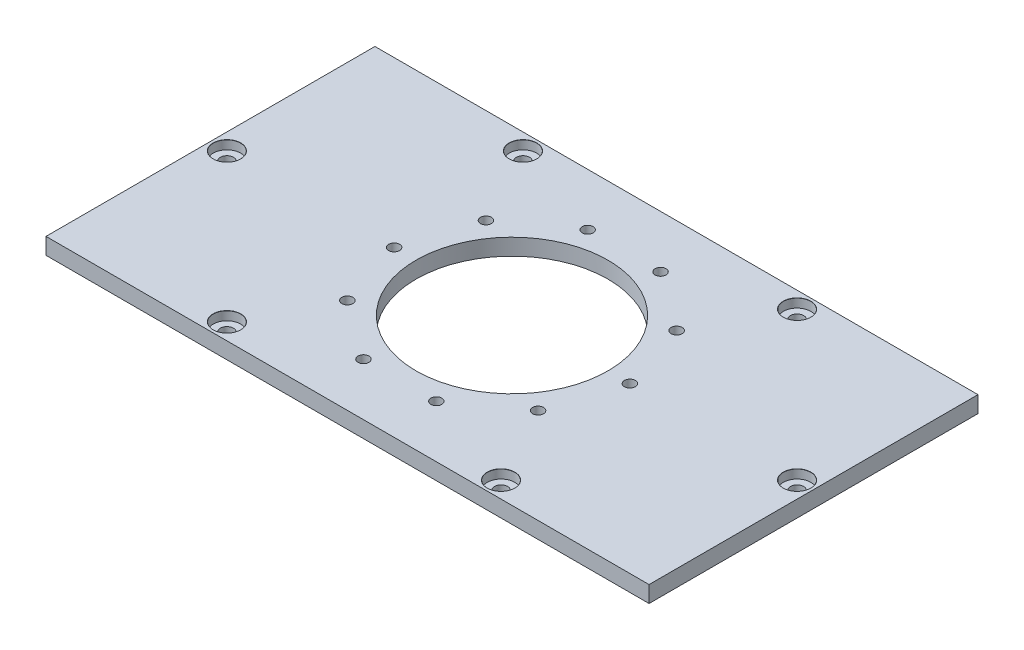
ISO-10303-21;
HEADER;
FILE_DESCRIPTION(('STEP AP214'),'2;1');
FILE_NAME('part.step','',(''),(''),'','','');
FILE_SCHEMA(('AUTOMOTIVE_DESIGN { 1 0 10303 214 1 1 1 1 }'));
ENDSEC;
DATA;
#1=APPLICATION_CONTEXT('core data for automotive mechanical design processes');
#2=APPLICATION_PROTOCOL_DEFINITION('international standard','automotive_design',2000,#1);
#3=PRODUCT_CONTEXT('',#1,'mechanical');
#4=PRODUCT('Part','Part','',(#3));
#5=PRODUCT_RELATED_PRODUCT_CATEGORY('part','',(#4));
#6=PRODUCT_DEFINITION_FORMATION('','',#4);
#7=PRODUCT_DEFINITION_CONTEXT('part definition',#1,'design');
#8=PRODUCT_DEFINITION('design','',#6,#7);
#9=PRODUCT_DEFINITION_SHAPE('','',#8);
#10=(LENGTH_UNIT() NAMED_UNIT(*) SI_UNIT(.MILLI.,.METRE.));
#11=(NAMED_UNIT(*) PLANE_ANGLE_UNIT() SI_UNIT($,.RADIAN.));
#12=(NAMED_UNIT(*) SI_UNIT($,.STERADIAN.) SOLID_ANGLE_UNIT());
#13=UNCERTAINTY_MEASURE_WITH_UNIT(LENGTH_MEASURE(1.E-05),#10,'distance_accuracy_value','');
#14=(GEOMETRIC_REPRESENTATION_CONTEXT(3) GLOBAL_UNCERTAINTY_ASSIGNED_CONTEXT((#13)) GLOBAL_UNIT_ASSIGNED_CONTEXT((#10,
#11,#12)) REPRESENTATION_CONTEXT('',''));
#15=CARTESIAN_POINT('',(0.,0.,0.));
#16=DIRECTION('',(0.,0.,1.));
#17=DIRECTION('',(1.,0.,0.));
#18=AXIS2_PLACEMENT_3D('',#15,#16,#17);
#19=CARTESIAN_POINT('',(0.,3.,0.));
#20=DIRECTION('',(1.,0.,0.));
#21=DIRECTION('',(0.,0.,-1.));
#22=AXIS2_PLACEMENT_3D('',#19,#20,#21);
#23=PLANE('',#22);
#24=DIRECTION('',(0.,0.,1.));
#25=VECTOR('',#24,1.);
#26=CARTESIAN_POINT('',(0.,0.,0.));
#27=LINE('',#26,#25);
#28=CARTESIAN_POINT('',(0.,0.,-60.));
#29=VERTEX_POINT('',#28);
#30=CARTESIAN_POINT('',(0.,0.,0.));
#31=VERTEX_POINT('',#30);
#32=EDGE_CURVE('E110',#29,#31,#27,.T.);
#33=ORIENTED_EDGE('',*,*,#32,.T.);
#34=DIRECTION('',(0.,-1.,0.));
#35=VECTOR('',#34,1.);
#36=CARTESIAN_POINT('',(0.,3.,0.));
#37=LINE('',#36,#35);
#38=CARTESIAN_POINT('',(0.,3.,0.));
#39=VERTEX_POINT('',#38);
#40=EDGE_CURVE('E11',#39,#31,#37,.T.);
#41=ORIENTED_EDGE('',*,*,#40,.F.);
#42=DIRECTION('',(0.,0.,1.));
#43=VECTOR('',#42,1.);
#44=CARTESIAN_POINT('',(0.,3.,0.));
#45=LINE('',#44,#43);
#46=CARTESIAN_POINT('',(0.,3.,-60.));
#47=VERTEX_POINT('',#46);
#48=EDGE_CURVE('E93',#47,#39,#45,.T.);
#49=ORIENTED_EDGE('',*,*,#48,.F.);
#50=DIRECTION('',(0.,-1.,0.));
#51=VECTOR('',#50,1.);
#52=CARTESIAN_POINT('',(0.,3.,-60.));
#53=LINE('',#52,#51);
#54=EDGE_CURVE('E106',#47,#29,#53,.T.);
#55=ORIENTED_EDGE('',*,*,#54,.T.);
#56=EDGE_LOOP('',(#33,#41,#49,#55));
#57=FACE_BOUND('',#56,.T.);
#58=ADVANCED_FACE('F39',(#57),#23,.F.);
#59=CARTESIAN_POINT('',(0.,3.,0.));
#60=DIRECTION('',(0.,0.,-1.));
#61=DIRECTION('',(-1.,0.,0.));
#62=AXIS2_PLACEMENT_3D('',#59,#60,#61);
#63=PLANE('',#62);
#64=DIRECTION('',(1.,0.,0.));
#65=VECTOR('',#64,1.);
#66=CARTESIAN_POINT('',(0.,0.,0.));
#67=LINE('',#66,#65);
#68=CARTESIAN_POINT('',(110.,0.,0.));
#69=VERTEX_POINT('',#68);
#70=EDGE_CURVE('E98',#31,#69,#67,.T.);
#71=ORIENTED_EDGE('',*,*,#70,.T.);
#72=DIRECTION('',(0.,-1.,0.));
#73=VECTOR('',#72,1.);
#74=CARTESIAN_POINT('',(110.,3.,0.));
#75=LINE('',#74,#73);
#76=CARTESIAN_POINT('',(110.,3.,0.));
#77=VERTEX_POINT('',#76);
#78=EDGE_CURVE('E49',#77,#69,#75,.T.);
#79=ORIENTED_EDGE('',*,*,#78,.F.);
#80=DIRECTION('',(1.,0.,0.));
#81=VECTOR('',#80,1.);
#82=CARTESIAN_POINT('',(0.,3.,0.));
#83=LINE('',#82,#81);
#84=EDGE_CURVE('E88',#39,#77,#83,.T.);
#85=ORIENTED_EDGE('',*,*,#84,.F.);
#86=ORIENTED_EDGE('',*,*,#40,.T.);
#87=EDGE_LOOP('',(#71,#79,#85,#86));
#88=FACE_BOUND('',#87,.T.);
#89=ADVANCED_FACE('F97',(#88),#63,.F.);
#90=CARTESIAN_POINT('',(110.,3.,0.));
#91=DIRECTION('',(-1.,0.,0.));
#92=DIRECTION('',(0.,0.,1.));
#93=AXIS2_PLACEMENT_3D('',#90,#91,#92);
#94=PLANE('',#93);
#95=DIRECTION('',(0.,0.,-1.));
#96=VECTOR('',#95,1.);
#97=CARTESIAN_POINT('',(110.,0.,0.));
#98=LINE('',#97,#96);
#99=CARTESIAN_POINT('',(110.,0.,-60.));
#100=VERTEX_POINT('',#99);
#101=EDGE_CURVE('E75',#69,#100,#98,.T.);
#102=ORIENTED_EDGE('',*,*,#101,.T.);
#103=DIRECTION('',(0.,-1.,0.));
#104=VECTOR('',#103,1.);
#105=CARTESIAN_POINT('',(110.,3.,-60.));
#106=LINE('',#105,#104);
#107=CARTESIAN_POINT('',(110.,3.,-60.));
#108=VERTEX_POINT('',#107);
#109=EDGE_CURVE('E100',#108,#100,#106,.T.);
#110=ORIENTED_EDGE('',*,*,#109,.F.);
#111=DIRECTION('',(0.,0.,-1.));
#112=VECTOR('',#111,1.);
#113=CARTESIAN_POINT('',(110.,3.,0.));
#114=LINE('',#113,#112);
#115=EDGE_CURVE('E91',#77,#108,#114,.T.);
#116=ORIENTED_EDGE('',*,*,#115,.F.);
#117=ORIENTED_EDGE('',*,*,#78,.T.);
#118=EDGE_LOOP('',(#102,#110,#116,#117));
#119=FACE_BOUND('',#118,.T.);
#120=ADVANCED_FACE('F102',(#119),#94,.F.);
#121=CARTESIAN_POINT('',(0.,3.,-60.));
#122=DIRECTION('',(0.,0.,1.));
#123=DIRECTION('',(1.,0.,0.));
#124=AXIS2_PLACEMENT_3D('',#121,#122,#123);
#125=PLANE('',#124);
#126=DIRECTION('',(-1.,0.,0.));
#127=VECTOR('',#126,1.);
#128=CARTESIAN_POINT('',(0.,0.,-60.));
#129=LINE('',#128,#127);
#130=EDGE_CURVE('E81',#100,#29,#129,.T.);
#131=ORIENTED_EDGE('',*,*,#130,.T.);
#132=ORIENTED_EDGE('',*,*,#54,.F.);
#133=DIRECTION('',(-1.,0.,0.));
#134=VECTOR('',#133,1.);
#135=CARTESIAN_POINT('',(0.,3.,-60.));
#136=LINE('',#135,#134);
#137=EDGE_CURVE('E58',#108,#47,#136,.T.);
#138=ORIENTED_EDGE('',*,*,#137,.F.);
#139=ORIENTED_EDGE('',*,*,#109,.T.);
#140=EDGE_LOOP('',(#131,#132,#138,#139));
#141=FACE_BOUND('',#140,.T.);
#142=ADVANCED_FACE('F343',(#141),#125,.F.);
#143=CARTESIAN_POINT('',(0.,3.,0.));
#144=DIRECTION('',(0.,-1.,0.));
#145=DIRECTION('',(0.,0.,-1.));
#146=AXIS2_PLACEMENT_3D('',#143,#144,#145);
#147=PLANE('',#146);
#148=CARTESIAN_POINT('',(48.3561346209386,3.,-9.55228489965415));
#149=DIRECTION('',(0.,1.,0.));
#150=DIRECTION('',(0.,0.,1.));
#151=AXIS2_PLACEMENT_3D('',#148,#149,#150);
#152=CIRCLE('',#151,0.999999999999998);
#153=CARTESIAN_POINT('',(48.3561346209386,3.,-8.55228489965415));
#154=VERTEX_POINT('',#153);
#155=EDGE_CURVE('E294',#154,#154,#152,.T.);
#156=ORIENTED_EDGE('',*,*,#155,.F.);
#157=EDGE_LOOP('',(#156));
#158=FACE_BOUND('',#157,.T.);
#159=CARTESIAN_POINT('',(61.6438653790614,3.,-9.55228489965415));
#160=DIRECTION('',(0.,1.,0.));
#161=DIRECTION('',(0.,0.,1.));
#162=AXIS2_PLACEMENT_3D('',#159,#160,#161);
#163=CIRCLE('',#162,1.00000000000001);
#164=CARTESIAN_POINT('',(61.6438653790614,3.,-8.55228489965415));
#165=VERTEX_POINT('',#164);
#166=EDGE_CURVE('E293',#165,#165,#163,.T.);
#167=ORIENTED_EDGE('',*,*,#166,.F.);
#168=EDGE_LOOP('',(#167));
#169=FACE_BOUND('',#168,.T.);
#170=CARTESIAN_POINT('',(72.3938653790614,3.,-17.3626170757118));
#171=DIRECTION('',(0.,1.,0.));
#172=DIRECTION('',(0.,0.,1.));
#173=AXIS2_PLACEMENT_3D('',#170,#171,#172);
#174=CIRCLE('',#173,0.999999999999998);
#175=CARTESIAN_POINT('',(72.3938653790614,3.,-16.3626170757118));
#176=VERTEX_POINT('',#175);
#177=EDGE_CURVE('E303',#176,#176,#174,.T.);
#178=ORIENTED_EDGE('',*,*,#177,.F.);
#179=EDGE_LOOP('',(#178));
#180=FACE_BOUND('',#179,.T.);
#181=CARTESIAN_POINT('',(76.5,3.,-30.));
#182=DIRECTION('',(0.,1.,0.));
#183=DIRECTION('',(0.,0.,1.));
#184=AXIS2_PLACEMENT_3D('',#181,#182,#183);
#185=CIRCLE('',#184,1.00000000000001);
#186=CARTESIAN_POINT('',(76.5,3.,-29.));
#187=VERTEX_POINT('',#186);
#188=EDGE_CURVE('E311',#187,#187,#185,.T.);
#189=ORIENTED_EDGE('',*,*,#188,.F.);
#190=EDGE_LOOP('',(#189));
#191=FACE_BOUND('',#190,.T.);
#192=CARTESIAN_POINT('',(72.3938653790614,3.,-42.6373829242881));
#193=DIRECTION('',(0.,1.,0.));
#194=DIRECTION('',(0.,0.,1.));
#195=AXIS2_PLACEMENT_3D('',#192,#193,#194);
#196=CIRCLE('',#195,0.999999999999998);
#197=CARTESIAN_POINT('',(72.3938653790614,3.,-41.6373829242881));
#198=VERTEX_POINT('',#197);
#199=EDGE_CURVE('E262',#198,#198,#196,.T.);
#200=ORIENTED_EDGE('',*,*,#199,.F.);
#201=EDGE_LOOP('',(#200));
#202=FACE_BOUND('',#201,.T.);
#203=CARTESIAN_POINT('',(61.6438653790614,3.,-50.4477151003458));
#204=DIRECTION('',(0.,1.,0.));
#205=DIRECTION('',(0.,0.,1.));
#206=AXIS2_PLACEMENT_3D('',#203,#204,#205);
#207=CIRCLE('',#206,0.999999999999961);
#208=CARTESIAN_POINT('',(61.6438653790614,3.,-49.4477151003458));
#209=VERTEX_POINT('',#208);
#210=EDGE_CURVE('E261',#209,#209,#207,.T.);
#211=ORIENTED_EDGE('',*,*,#210,.F.);
#212=EDGE_LOOP('',(#211));
#213=FACE_BOUND('',#212,.T.);
#214=CARTESIAN_POINT('',(48.3561346209386,3.,-50.4477151003458));
#215=DIRECTION('',(0.,1.,0.));
#216=DIRECTION('',(0.,0.,1.));
#217=AXIS2_PLACEMENT_3D('',#214,#215,#216);
#218=CIRCLE('',#217,1.00000000000001);
#219=CARTESIAN_POINT('',(48.3561346209386,3.,-49.4477151003458));
#220=VERTEX_POINT('',#219);
#221=EDGE_CURVE('E271',#220,#220,#218,.T.);
#222=ORIENTED_EDGE('',*,*,#221,.F.);
#223=EDGE_LOOP('',(#222));
#224=FACE_BOUND('',#223,.T.);
#225=CARTESIAN_POINT('',(37.6061346209386,3.,-17.3626170757118));
#226=DIRECTION('',(0.,1.,0.));
#227=DIRECTION('',(0.,0.,1.));
#228=AXIS2_PLACEMENT_3D('',#225,#226,#227);
#229=CIRCLE('',#228,0.999999999999991);
#230=CARTESIAN_POINT('',(37.6061346209386,3.,-16.3626170757118));
#231=VERTEX_POINT('',#230);
#232=EDGE_CURVE('E279',#231,#231,#229,.T.);
#233=ORIENTED_EDGE('',*,*,#232,.F.);
#234=EDGE_LOOP('',(#233));
#235=FACE_BOUND('',#234,.T.);
#236=CARTESIAN_POINT('',(33.5,3.,-30.));
#237=DIRECTION('',(0.,1.,0.));
#238=DIRECTION('',(0.,0.,1.));
#239=AXIS2_PLACEMENT_3D('',#236,#237,#238);
#240=CIRCLE('',#239,0.999999999999983);
#241=CARTESIAN_POINT('',(33.5,3.,-29.));
#242=VERTEX_POINT('',#241);
#243=EDGE_CURVE('E325',#242,#242,#240,.T.);
#244=ORIENTED_EDGE('',*,*,#243,.F.);
#245=EDGE_LOOP('',(#244));
#246=FACE_BOUND('',#245,.T.);
#247=CARTESIAN_POINT('',(55.,3.,-30.));
#248=DIRECTION('',(0.,1.,0.));
#249=DIRECTION('',(0.,0.,1.));
#250=AXIS2_PLACEMENT_3D('',#247,#248,#249);
#251=CIRCLE('',#250,17.5);
#252=CARTESIAN_POINT('',(55.,3.,-12.5));
#253=VERTEX_POINT('',#252);
#254=EDGE_CURVE('E326',#253,#253,#251,.T.);
#255=ORIENTED_EDGE('',*,*,#254,.F.);
#256=EDGE_LOOP('',(#255));
#257=FACE_BOUND('',#256,.T.);
#258=CARTESIAN_POINT('',(37.6061346209386,3.,-42.6373829242881));
#259=DIRECTION('',(0.,1.,0.));
#260=DIRECTION('',(0.,0.,1.));
#261=AXIS2_PLACEMENT_3D('',#258,#259,#260);
#262=CIRCLE('',#261,0.999999999999998);
#263=CARTESIAN_POINT('',(37.6061346209386,3.,-41.6373829242881));
#264=VERTEX_POINT('',#263);
#265=EDGE_CURVE('E252',#264,#264,#262,.T.);
#266=ORIENTED_EDGE('',*,*,#265,.F.);
#267=EDGE_LOOP('',(#266));
#268=FACE_BOUND('',#267,.T.);
#269=CARTESIAN_POINT('',(80.,3.,-3.));
#270=DIRECTION('',(0.,1.,0.));
#271=DIRECTION('',(0.,0.,1.));
#272=AXIS2_PLACEMENT_3D('',#269,#270,#271);
#273=CIRCLE('',#272,2.525);
#274=CARTESIAN_POINT('',(80.,3.,-0.475000000000001));
#275=VERTEX_POINT('',#274);
#276=EDGE_CURVE('E244',#275,#275,#273,.T.);
#277=ORIENTED_EDGE('',*,*,#276,.F.);
#278=EDGE_LOOP('',(#277));
#279=FACE_BOUND('',#278,.T.);
#280=CARTESIAN_POINT('',(107.,3.,-30.));
#281=DIRECTION('',(0.,1.,0.));
#282=DIRECTION('',(0.,0.,1.));
#283=AXIS2_PLACEMENT_3D('',#280,#281,#282);
#284=CIRCLE('',#283,2.525);
#285=CARTESIAN_POINT('',(107.,3.,-27.475));
#286=VERTEX_POINT('',#285);
#287=EDGE_CURVE('E228',#286,#286,#284,.T.);
#288=ORIENTED_EDGE('',*,*,#287,.F.);
#289=EDGE_LOOP('',(#288));
#290=FACE_BOUND('',#289,.T.);
#291=CARTESIAN_POINT('',(80.,3.,-57.));
#292=DIRECTION('',(0.,1.,0.));
#293=DIRECTION('',(0.,0.,1.));
#294=AXIS2_PLACEMENT_3D('',#291,#292,#293);
#295=CIRCLE('',#294,2.525);
#296=CARTESIAN_POINT('',(80.,3.,-54.475));
#297=VERTEX_POINT('',#296);
#298=EDGE_CURVE('E212',#297,#297,#295,.T.);
#299=ORIENTED_EDGE('',*,*,#298,.F.);
#300=EDGE_LOOP('',(#299));
#301=FACE_BOUND('',#300,.T.);
#302=CARTESIAN_POINT('',(30.,3.,-57.));
#303=DIRECTION('',(0.,1.,0.));
#304=DIRECTION('',(0.,0.,1.));
#305=AXIS2_PLACEMENT_3D('',#302,#303,#304);
#306=CIRCLE('',#305,2.525);
#307=CARTESIAN_POINT('',(30.,3.,-54.475));
#308=VERTEX_POINT('',#307);
#309=EDGE_CURVE('E196',#308,#308,#306,.T.);
#310=ORIENTED_EDGE('',*,*,#309,.F.);
#311=EDGE_LOOP('',(#310));
#312=FACE_BOUND('',#311,.T.);
#313=CARTESIAN_POINT('',(3.,3.,-30.));
#314=DIRECTION('',(0.,1.,0.));
#315=DIRECTION('',(0.,0.,1.));
#316=AXIS2_PLACEMENT_3D('',#313,#314,#315);
#317=CIRCLE('',#316,2.525);
#318=CARTESIAN_POINT('',(3.,3.,-27.475));
#319=VERTEX_POINT('',#318);
#320=EDGE_CURVE('E180',#319,#319,#317,.T.);
#321=ORIENTED_EDGE('',*,*,#320,.F.);
#322=EDGE_LOOP('',(#321));
#323=FACE_BOUND('',#322,.T.);
#324=CARTESIAN_POINT('',(30.,3.,-3.));
#325=DIRECTION('',(0.,1.,0.));
#326=DIRECTION('',(0.,0.,1.));
#327=AXIS2_PLACEMENT_3D('',#324,#325,#326);
#328=CIRCLE('',#327,2.525);
#329=CARTESIAN_POINT('',(30.,3.,-0.475000000000001));
#330=VERTEX_POINT('',#329);
#331=EDGE_CURVE('E164',#330,#330,#328,.T.);
#332=ORIENTED_EDGE('',*,*,#331,.F.);
#333=EDGE_LOOP('',(#332));
#334=FACE_BOUND('',#333,.T.);
#335=ORIENTED_EDGE('',*,*,#48,.T.);
#336=ORIENTED_EDGE('',*,*,#84,.T.);
#337=ORIENTED_EDGE('',*,*,#115,.T.);
#338=ORIENTED_EDGE('',*,*,#137,.T.);
#339=EDGE_LOOP('',(#335,#336,#337,#338));
#340=FACE_BOUND('',#339,.T.);
#341=ADVANCED_FACE('F89',(#158,#169,#180,#191,#202,#213,#224,#235,#246,#257,#268,#279,#290,#301,
#312,#323,#334,#340),#147,.F.);
#342=CARTESIAN_POINT('',(0.,0.,0.));
#343=DIRECTION('',(0.,-1.,0.));
#344=DIRECTION('',(0.,0.,-1.));
#345=AXIS2_PLACEMENT_3D('',#342,#343,#344);
#346=PLANE('',#345);
#347=CARTESIAN_POINT('',(48.3561346209386,0.,-9.55228489965415));
#348=DIRECTION('',(0.,-1.,0.));
#349=DIRECTION('',(0.,0.,-1.));
#350=AXIS2_PLACEMENT_3D('',#347,#348,#349);
#351=CIRCLE('',#350,0.999999999999998);
#352=CARTESIAN_POINT('',(48.3561346209386,0.,-10.5522848996541));
#353=VERTEX_POINT('',#352);
#354=EDGE_CURVE('E289',#353,#353,#351,.F.);
#355=ORIENTED_EDGE('',*,*,#354,.T.);
#356=EDGE_LOOP('',(#355));
#357=FACE_BOUND('',#356,.T.);
#358=CARTESIAN_POINT('',(61.6438653790614,0.,-9.55228489965415));
#359=DIRECTION('',(0.,-1.,0.));
#360=DIRECTION('',(0.,0.,-1.));
#361=AXIS2_PLACEMENT_3D('',#358,#359,#360);
#362=CIRCLE('',#361,1.00000000000001);
#363=CARTESIAN_POINT('',(61.6438653790614,0.,-10.5522848996542));
#364=VERTEX_POINT('',#363);
#365=EDGE_CURVE('E299',#364,#364,#362,.F.);
#366=ORIENTED_EDGE('',*,*,#365,.T.);
#367=EDGE_LOOP('',(#366));
#368=FACE_BOUND('',#367,.T.);
#369=CARTESIAN_POINT('',(72.3938653790614,0.,-17.3626170757118));
#370=DIRECTION('',(0.,-1.,0.));
#371=DIRECTION('',(0.,0.,-1.));
#372=AXIS2_PLACEMENT_3D('',#369,#370,#371);
#373=CIRCLE('',#372,0.999999999999998);
#374=CARTESIAN_POINT('',(72.3938653790614,0.,-18.3626170757118));
#375=VERTEX_POINT('',#374);
#376=EDGE_CURVE('E307',#375,#375,#373,.F.);
#377=ORIENTED_EDGE('',*,*,#376,.T.);
#378=EDGE_LOOP('',(#377));
#379=FACE_BOUND('',#378,.T.);
#380=CARTESIAN_POINT('',(76.5,0.,-30.));
#381=DIRECTION('',(0.,-1.,0.));
#382=DIRECTION('',(0.,0.,-1.));
#383=AXIS2_PLACEMENT_3D('',#380,#381,#382);
#384=CIRCLE('',#383,1.00000000000001);
#385=CARTESIAN_POINT('',(76.5,0.,-31.));
#386=VERTEX_POINT('',#385);
#387=EDGE_CURVE('E266',#386,#386,#384,.F.);
#388=ORIENTED_EDGE('',*,*,#387,.T.);
#389=EDGE_LOOP('',(#388));
#390=FACE_BOUND('',#389,.T.);
#391=CARTESIAN_POINT('',(72.3938653790614,0.,-42.6373829242881));
#392=DIRECTION('',(0.,-1.,0.));
#393=DIRECTION('',(0.,0.,-1.));
#394=AXIS2_PLACEMENT_3D('',#391,#392,#393);
#395=CIRCLE('',#394,0.999999999999998);
#396=CARTESIAN_POINT('',(72.3938653790614,0.,-43.6373829242881));
#397=VERTEX_POINT('',#396);
#398=EDGE_CURVE('E257',#397,#397,#395,.F.);
#399=ORIENTED_EDGE('',*,*,#398,.T.);
#400=EDGE_LOOP('',(#399));
#401=FACE_BOUND('',#400,.T.);
#402=CARTESIAN_POINT('',(61.6438653790614,0.,-50.4477151003458));
#403=DIRECTION('',(0.,-1.,0.));
#404=DIRECTION('',(0.,0.,-1.));
#405=AXIS2_PLACEMENT_3D('',#402,#403,#404);
#406=CIRCLE('',#405,0.999999999999961);
#407=CARTESIAN_POINT('',(61.6438653790614,0.,-51.4477151003457));
#408=VERTEX_POINT('',#407);
#409=EDGE_CURVE('E267',#408,#408,#406,.F.);
#410=ORIENTED_EDGE('',*,*,#409,.T.);
#411=EDGE_LOOP('',(#410));
#412=FACE_BOUND('',#411,.T.);
#413=CARTESIAN_POINT('',(48.3561346209386,0.,-50.4477151003458));
#414=DIRECTION('',(0.,-1.,0.));
#415=DIRECTION('',(0.,0.,-1.));
#416=AXIS2_PLACEMENT_3D('',#413,#414,#415);
#417=CIRCLE('',#416,1.00000000000001);
#418=CARTESIAN_POINT('',(48.3561346209386,0.,-51.4477151003458));
#419=VERTEX_POINT('',#418);
#420=EDGE_CURVE('E275',#419,#419,#417,.F.);
#421=ORIENTED_EDGE('',*,*,#420,.T.);
#422=EDGE_LOOP('',(#421));
#423=FACE_BOUND('',#422,.T.);
#424=CARTESIAN_POINT('',(37.6061346209386,0.,-17.3626170757118));
#425=DIRECTION('',(0.,-1.,0.));
#426=DIRECTION('',(0.,0.,-1.));
#427=AXIS2_PLACEMENT_3D('',#424,#425,#426);
#428=CIRCLE('',#427,0.999999999999991);
#429=CARTESIAN_POINT('',(37.6061346209386,0.,-18.3626170757118));
#430=VERTEX_POINT('',#429);
#431=EDGE_CURVE('E256',#430,#430,#428,.F.);
#432=ORIENTED_EDGE('',*,*,#431,.T.);
#433=EDGE_LOOP('',(#432));
#434=FACE_BOUND('',#433,.T.);
#435=CARTESIAN_POINT('',(33.5,0.,-30.));
#436=DIRECTION('',(0.,-1.,0.));
#437=DIRECTION('',(0.,0.,-1.));
#438=AXIS2_PLACEMENT_3D('',#435,#436,#437);
#439=CIRCLE('',#438,0.999999999999983);
#440=CARTESIAN_POINT('',(33.5,0.,-31.));
#441=VERTEX_POINT('',#440);
#442=EDGE_CURVE('E298',#441,#441,#439,.F.);
#443=ORIENTED_EDGE('',*,*,#442,.T.);
#444=EDGE_LOOP('',(#443));
#445=FACE_BOUND('',#444,.T.);
#446=CARTESIAN_POINT('',(55.,0.,-30.));
#447=DIRECTION('',(0.,-1.,0.));
#448=DIRECTION('',(0.,0.,-1.));
#449=AXIS2_PLACEMENT_3D('',#446,#447,#448);
#450=CIRCLE('',#449,17.5);
#451=CARTESIAN_POINT('',(55.,0.,-47.5));
#452=VERTEX_POINT('',#451);
#453=EDGE_CURVE('E321',#452,#452,#450,.F.);
#454=ORIENTED_EDGE('',*,*,#453,.T.);
#455=EDGE_LOOP('',(#454));
#456=FACE_BOUND('',#455,.T.);
#457=CARTESIAN_POINT('',(37.6061346209386,0.,-42.6373829242881));
#458=DIRECTION('',(0.,-1.,0.));
#459=DIRECTION('',(0.,0.,-1.));
#460=AXIS2_PLACEMENT_3D('',#457,#458,#459);
#461=CIRCLE('',#460,0.999999999999998);
#462=CARTESIAN_POINT('',(37.6061346209386,0.,-43.6373829242881));
#463=VERTEX_POINT('',#462);
#464=EDGE_CURVE('E248',#463,#463,#461,.F.);
#465=ORIENTED_EDGE('',*,*,#464,.T.);
#466=EDGE_LOOP('',(#465));
#467=FACE_BOUND('',#466,.T.);
#468=CARTESIAN_POINT('',(30.,0.,-57.));
#469=DIRECTION('',(0.,-1.,0.));
#470=DIRECTION('',(0.,0.,-1.));
#471=AXIS2_PLACEMENT_3D('',#468,#469,#470);
#472=CIRCLE('',#471,1.19999999999999);
#473=CARTESIAN_POINT('',(30.,0.,-58.2));
#474=VERTEX_POINT('',#473);
#475=EDGE_CURVE('E42',#474,#474,#472,.T.);
#476=ORIENTED_EDGE('',*,*,#475,.F.);
#477=EDGE_LOOP('',(#476));
#478=FACE_BOUND('',#477,.T.);
#479=CARTESIAN_POINT('',(80.,0.,-57.));
#480=DIRECTION('',(0.,-1.,0.));
#481=DIRECTION('',(0.,0.,-1.));
#482=AXIS2_PLACEMENT_3D('',#479,#480,#481);
#483=CIRCLE('',#482,1.19999999999999);
#484=CARTESIAN_POINT('',(80.,0.,-58.2));
#485=VERTEX_POINT('',#484);
#486=EDGE_CURVE('E139',#485,#485,#483,.T.);
#487=ORIENTED_EDGE('',*,*,#486,.F.);
#488=EDGE_LOOP('',(#487));
#489=FACE_BOUND('',#488,.T.);
#490=CARTESIAN_POINT('',(107.,0.,-30.));
#491=DIRECTION('',(0.,-1.,0.));
#492=DIRECTION('',(0.,0.,-1.));
#493=AXIS2_PLACEMENT_3D('',#490,#491,#492);
#494=CIRCLE('',#493,1.19999999999999);
#495=CARTESIAN_POINT('',(107.,0.,-31.2));
#496=VERTEX_POINT('',#495);
#497=EDGE_CURVE('E136',#496,#496,#494,.T.);
#498=ORIENTED_EDGE('',*,*,#497,.F.);
#499=EDGE_LOOP('',(#498));
#500=FACE_BOUND('',#499,.T.);
#501=CARTESIAN_POINT('',(80.,0.,-3.));
#502=DIRECTION('',(0.,-1.,0.));
#503=DIRECTION('',(0.,0.,-1.));
#504=AXIS2_PLACEMENT_3D('',#501,#502,#503);
#505=CIRCLE('',#504,1.19999999999999);
#506=CARTESIAN_POINT('',(80.,0.,-4.19999999999999));
#507=VERTEX_POINT('',#506);
#508=EDGE_CURVE('E132',#507,#507,#505,.T.);
#509=ORIENTED_EDGE('',*,*,#508,.F.);
#510=EDGE_LOOP('',(#509));
#511=FACE_BOUND('',#510,.T.);
#512=CARTESIAN_POINT('',(30.,0.,-3.));
#513=DIRECTION('',(0.,-1.,0.));
#514=DIRECTION('',(0.,0.,-1.));
#515=AXIS2_PLACEMENT_3D('',#512,#513,#514);
#516=CIRCLE('',#515,1.19999999999999);
#517=CARTESIAN_POINT('',(30.,0.,-4.19999999999999));
#518=VERTEX_POINT('',#517);
#519=EDGE_CURVE('E128',#518,#518,#516,.T.);
#520=ORIENTED_EDGE('',*,*,#519,.F.);
#521=EDGE_LOOP('',(#520));
#522=FACE_BOUND('',#521,.T.);
#523=CARTESIAN_POINT('',(3.,0.,-30.));
#524=DIRECTION('',(0.,-1.,0.));
#525=DIRECTION('',(0.,0.,-1.));
#526=AXIS2_PLACEMENT_3D('',#523,#524,#525);
#527=CIRCLE('',#526,1.19999999999999);
#528=CARTESIAN_POINT('',(3.,0.,-31.2));
#529=VERTEX_POINT('',#528);
#530=EDGE_CURVE('E114',#529,#529,#527,.T.);
#531=ORIENTED_EDGE('',*,*,#530,.F.);
#532=EDGE_LOOP('',(#531));
#533=FACE_BOUND('',#532,.T.);
#534=ORIENTED_EDGE('',*,*,#32,.F.);
#535=ORIENTED_EDGE('',*,*,#130,.F.);
#536=ORIENTED_EDGE('',*,*,#101,.F.);
#537=ORIENTED_EDGE('',*,*,#70,.F.);
#538=EDGE_LOOP('',(#534,#535,#536,#537));
#539=FACE_BOUND('',#538,.T.);
#540=ADVANCED_FACE('F342',(#357,#368,#379,#390,#401,#412,#423,#434,#445,#456,#467,#478,#489,
#500,#511,#522,#533,#539),#346,.T.);
#541=CARTESIAN_POINT('',(3.,3.,-30.));
#542=DIRECTION('',(0.,1.,0.));
#543=DIRECTION('',(0.,0.,1.));
#544=AXIS2_PLACEMENT_3D('',#541,#542,#543);
#545=CYLINDRICAL_SURFACE('',#544,1.19999999999999);
#546=ORIENTED_EDGE('',*,*,#530,.T.);
#547=EDGE_LOOP('',(#546));
#548=FACE_BOUND('',#547,.T.);
#549=CARTESIAN_POINT('',(3.,1.4,-30.));
#550=DIRECTION('',(0.,1.,0.));
#551=DIRECTION('',(0.,0.,1.));
#552=AXIS2_PLACEMENT_3D('',#549,#550,#551);
#553=CIRCLE('',#552,1.2);
#554=CARTESIAN_POINT('',(3.,1.4,-28.8));
#555=VERTEX_POINT('',#554);
#556=EDGE_CURVE('E168',#555,#555,#553,.T.);
#557=ORIENTED_EDGE('',*,*,#556,.T.);
#558=EDGE_LOOP('',(#557));
#559=FACE_BOUND('',#558,.T.);
#560=ADVANCED_FACE('F387',(#548,#559),#545,.F.);
#561=CARTESIAN_POINT('',(30.,3.,-3.));
#562=DIRECTION('',(0.,1.,0.));
#563=DIRECTION('',(0.,0.,1.));
#564=AXIS2_PLACEMENT_3D('',#561,#562,#563);
#565=CYLINDRICAL_SURFACE('',#564,1.19999999999999);
#566=ORIENTED_EDGE('',*,*,#519,.T.);
#567=EDGE_LOOP('',(#566));
#568=FACE_BOUND('',#567,.T.);
#569=CARTESIAN_POINT('',(30.,1.4,-3.));
#570=DIRECTION('',(0.,1.,0.));
#571=DIRECTION('',(0.,0.,1.));
#572=AXIS2_PLACEMENT_3D('',#569,#570,#571);
#573=CIRCLE('',#572,1.2);
#574=CARTESIAN_POINT('',(30.,1.4,-1.8));
#575=VERTEX_POINT('',#574);
#576=EDGE_CURVE('E146',#575,#575,#573,.T.);
#577=ORIENTED_EDGE('',*,*,#576,.T.);
#578=EDGE_LOOP('',(#577));
#579=FACE_BOUND('',#578,.T.);
#580=ADVANCED_FACE('F393',(#568,#579),#565,.F.);
#581=CARTESIAN_POINT('',(80.,3.,-3.));
#582=DIRECTION('',(0.,1.,0.));
#583=DIRECTION('',(0.,0.,1.));
#584=AXIS2_PLACEMENT_3D('',#581,#582,#583);
#585=CYLINDRICAL_SURFACE('',#584,1.19999999999999);
#586=ORIENTED_EDGE('',*,*,#508,.T.);
#587=EDGE_LOOP('',(#586));
#588=FACE_BOUND('',#587,.T.);
#589=CARTESIAN_POINT('',(80.,1.4,-3.));
#590=DIRECTION('',(0.,1.,0.));
#591=DIRECTION('',(0.,0.,1.));
#592=AXIS2_PLACEMENT_3D('',#589,#590,#591);
#593=CIRCLE('',#592,1.19999999999999);
#594=CARTESIAN_POINT('',(80.,1.4,-1.80000000000001));
#595=VERTEX_POINT('',#594);
#596=EDGE_CURVE('E232',#595,#595,#593,.T.);
#597=ORIENTED_EDGE('',*,*,#596,.T.);
#598=EDGE_LOOP('',(#597));
#599=FACE_BOUND('',#598,.T.);
#600=ADVANCED_FACE('F722',(#588,#599),#585,.F.);
#601=CARTESIAN_POINT('',(107.,3.,-30.));
#602=DIRECTION('',(0.,1.,0.));
#603=DIRECTION('',(0.,0.,1.));
#604=AXIS2_PLACEMENT_3D('',#601,#602,#603);
#605=CYLINDRICAL_SURFACE('',#604,1.19999999999999);
#606=ORIENTED_EDGE('',*,*,#497,.T.);
#607=EDGE_LOOP('',(#606));
#608=FACE_BOUND('',#607,.T.);
#609=CARTESIAN_POINT('',(107.,1.4,-30.));
#610=DIRECTION('',(0.,1.,0.));
#611=DIRECTION('',(0.,0.,1.));
#612=AXIS2_PLACEMENT_3D('',#609,#610,#611);
#613=CIRCLE('',#612,1.19999999999999);
#614=CARTESIAN_POINT('',(107.,1.4,-28.8));
#615=VERTEX_POINT('',#614);
#616=EDGE_CURVE('E216',#615,#615,#613,.T.);
#617=ORIENTED_EDGE('',*,*,#616,.T.);
#618=EDGE_LOOP('',(#617));
#619=FACE_BOUND('',#618,.T.);
#620=ADVANCED_FACE('F714',(#608,#619),#605,.F.);
#621=CARTESIAN_POINT('',(80.,3.,-57.));
#622=DIRECTION('',(0.,1.,0.));
#623=DIRECTION('',(0.,0.,1.));
#624=AXIS2_PLACEMENT_3D('',#621,#622,#623);
#625=CYLINDRICAL_SURFACE('',#624,1.19999999999999);
#626=ORIENTED_EDGE('',*,*,#486,.T.);
#627=EDGE_LOOP('',(#626));
#628=FACE_BOUND('',#627,.T.);
#629=CARTESIAN_POINT('',(80.,1.4,-57.));
#630=DIRECTION('',(0.,1.,0.));
#631=DIRECTION('',(0.,0.,1.));
#632=AXIS2_PLACEMENT_3D('',#629,#630,#631);
#633=CIRCLE('',#632,1.19999999999999);
#634=CARTESIAN_POINT('',(80.,1.4,-55.8));
#635=VERTEX_POINT('',#634);
#636=EDGE_CURVE('E200',#635,#635,#633,.T.);
#637=ORIENTED_EDGE('',*,*,#636,.T.);
#638=EDGE_LOOP('',(#637));
#639=FACE_BOUND('',#638,.T.);
#640=ADVANCED_FACE('F706',(#628,#639),#625,.F.);
#641=CARTESIAN_POINT('',(30.,3.,-57.));
#642=DIRECTION('',(0.,1.,0.));
#643=DIRECTION('',(0.,0.,1.));
#644=AXIS2_PLACEMENT_3D('',#641,#642,#643);
#645=CYLINDRICAL_SURFACE('',#644,1.19999999999999);
#646=ORIENTED_EDGE('',*,*,#475,.T.);
#647=EDGE_LOOP('',(#646));
#648=FACE_BOUND('',#647,.T.);
#649=CARTESIAN_POINT('',(30.,1.4,-57.));
#650=DIRECTION('',(0.,1.,0.));
#651=DIRECTION('',(0.,0.,1.));
#652=AXIS2_PLACEMENT_3D('',#649,#650,#651);
#653=CIRCLE('',#652,1.2);
#654=CARTESIAN_POINT('',(30.,1.4,-55.8));
#655=VERTEX_POINT('',#654);
#656=EDGE_CURVE('E184',#655,#655,#653,.T.);
#657=ORIENTED_EDGE('',*,*,#656,.T.);
#658=EDGE_LOOP('',(#657));
#659=FACE_BOUND('',#658,.T.);
#660=ADVANCED_FACE('F697',(#648,#659),#645,.F.);
#661=CARTESIAN_POINT('',(31.2,1.4,-3.));
#662=DIRECTION('',(0.,-1.,0.));
#663=DIRECTION('',(0.,0.,-1.));
#664=AXIS2_PLACEMENT_3D('',#661,#662,#663);
#665=PLANE('',#664);
#666=ORIENTED_EDGE('',*,*,#576,.F.);
#667=EDGE_LOOP('',(#666));
#668=FACE_BOUND('',#667,.T.);
#669=CARTESIAN_POINT('',(30.,1.4,-3.));
#670=DIRECTION('',(0.,1.,0.));
#671=DIRECTION('',(0.,0.,1.));
#672=AXIS2_PLACEMENT_3D('',#669,#670,#671);
#673=CIRCLE('',#672,2.5);
#674=CARTESIAN_POINT('',(30.,1.4,-0.499999999999998));
#675=VERTEX_POINT('',#674);
#676=EDGE_CURVE('E151',#675,#675,#673,.T.);
#677=ORIENTED_EDGE('',*,*,#676,.T.);
#678=EDGE_LOOP('',(#677));
#679=FACE_BOUND('',#678,.T.);
#680=ADVANCED_FACE('F375',(#668,#679),#665,.F.);
#681=CARTESIAN_POINT('',(30.,3.,-3.));
#682=DIRECTION('',(0.,1.,0.));
#683=DIRECTION('',(0.,0.,1.));
#684=AXIS2_PLACEMENT_3D('',#681,#682,#683);
#685=CYLINDRICAL_SURFACE('',#684,2.5);
#686=ORIENTED_EDGE('',*,*,#676,.F.);
#687=EDGE_LOOP('',(#686));
#688=FACE_BOUND('',#687,.T.);
#689=CARTESIAN_POINT('',(30.,2.975,-3.));
#690=DIRECTION('',(0.,1.,0.));
#691=DIRECTION('',(0.,0.,1.));
#692=AXIS2_PLACEMENT_3D('',#689,#690,#691);
#693=CIRCLE('',#692,2.5);
#694=CARTESIAN_POINT('',(30.,2.975,-0.499999999999998));
#695=VERTEX_POINT('',#694);
#696=EDGE_CURVE('E157',#695,#695,#693,.T.);
#697=ORIENTED_EDGE('',*,*,#696,.T.);
#698=EDGE_LOOP('',(#697));
#699=FACE_BOUND('',#698,.T.);
#700=ADVANCED_FACE('F365',(#688,#699),#685,.F.);
#701=CARTESIAN_POINT('',(30.,3.,-3.));
#702=DIRECTION('',(0.,1.,0.));
#703=DIRECTION('',(0.,0.,1.));
#704=AXIS2_PLACEMENT_3D('',#701,#702,#703);
#705=CONICAL_SURFACE('',#704,2.525,0.785398163397396);
#706=ORIENTED_EDGE('',*,*,#696,.F.);
#707=EDGE_LOOP('',(#706));
#708=FACE_BOUND('',#707,.T.);
#709=ORIENTED_EDGE('',*,*,#331,.T.);
#710=EDGE_LOOP('',(#709));
#711=FACE_BOUND('',#710,.T.);
#712=ADVANCED_FACE('F362',(#708,#711),#705,.F.);
#713=CARTESIAN_POINT('',(4.2,1.4,-30.));
#714=DIRECTION('',(0.,-1.,0.));
#715=DIRECTION('',(0.,0.,-1.));
#716=AXIS2_PLACEMENT_3D('',#713,#714,#715);
#717=PLANE('',#716);
#718=ORIENTED_EDGE('',*,*,#556,.F.);
#719=EDGE_LOOP('',(#718));
#720=FACE_BOUND('',#719,.T.);
#721=CARTESIAN_POINT('',(3.,1.4,-30.));
#722=DIRECTION('',(0.,1.,0.));
#723=DIRECTION('',(0.,0.,1.));
#724=AXIS2_PLACEMENT_3D('',#721,#722,#723);
#725=CIRCLE('',#724,2.5);
#726=CARTESIAN_POINT('',(3.,1.4,-27.5));
#727=VERTEX_POINT('',#726);
#728=EDGE_CURVE('E172',#727,#727,#725,.T.);
#729=ORIENTED_EDGE('',*,*,#728,.T.);
#730=EDGE_LOOP('',(#729));
#731=FACE_BOUND('',#730,.T.);
#732=ADVANCED_FACE('F364',(#720,#731),#717,.F.);
#733=CARTESIAN_POINT('',(3.,3.,-30.));
#734=DIRECTION('',(0.,1.,0.));
#735=DIRECTION('',(0.,0.,1.));
#736=AXIS2_PLACEMENT_3D('',#733,#734,#735);
#737=CYLINDRICAL_SURFACE('',#736,2.5);
#738=ORIENTED_EDGE('',*,*,#728,.F.);
#739=EDGE_LOOP('',(#738));
#740=FACE_BOUND('',#739,.T.);
#741=CARTESIAN_POINT('',(3.,2.975,-30.));
#742=DIRECTION('',(0.,1.,0.));
#743=DIRECTION('',(0.,0.,1.));
#744=AXIS2_PLACEMENT_3D('',#741,#742,#743);
#745=CIRCLE('',#744,2.5);
#746=CARTESIAN_POINT('',(3.,2.975,-27.5));
#747=VERTEX_POINT('',#746);
#748=EDGE_CURVE('E176',#747,#747,#745,.T.);
#749=ORIENTED_EDGE('',*,*,#748,.T.);
#750=EDGE_LOOP('',(#749));
#751=FACE_BOUND('',#750,.T.);
#752=ADVANCED_FACE('F372',(#740,#751),#737,.F.);
#753=CARTESIAN_POINT('',(3.,3.,-30.));
#754=DIRECTION('',(0.,1.,0.));
#755=DIRECTION('',(0.,0.,1.));
#756=AXIS2_PLACEMENT_3D('',#753,#754,#755);
#757=CONICAL_SURFACE('',#756,2.525,0.785398163397431);
#758=ORIENTED_EDGE('',*,*,#748,.F.);
#759=EDGE_LOOP('',(#758));
#760=FACE_BOUND('',#759,.T.);
#761=ORIENTED_EDGE('',*,*,#320,.T.);
#762=EDGE_LOOP('',(#761));
#763=FACE_BOUND('',#762,.T.);
#764=ADVANCED_FACE('F584',(#760,#763),#757,.F.);
#765=CARTESIAN_POINT('',(31.2,1.4,-57.));
#766=DIRECTION('',(0.,-1.,0.));
#767=DIRECTION('',(0.,0.,-1.));
#768=AXIS2_PLACEMENT_3D('',#765,#766,#767);
#769=PLANE('',#768);
#770=ORIENTED_EDGE('',*,*,#656,.F.);
#771=EDGE_LOOP('',(#770));
#772=FACE_BOUND('',#771,.T.);
#773=CARTESIAN_POINT('',(30.,1.4,-57.));
#774=DIRECTION('',(0.,1.,0.));
#775=DIRECTION('',(0.,0.,1.));
#776=AXIS2_PLACEMENT_3D('',#773,#774,#775);
#777=CIRCLE('',#776,2.5);
#778=CARTESIAN_POINT('',(30.,1.4,-54.5));
#779=VERTEX_POINT('',#778);
#780=EDGE_CURVE('E188',#779,#779,#777,.T.);
#781=ORIENTED_EDGE('',*,*,#780,.T.);
#782=EDGE_LOOP('',(#781));
#783=FACE_BOUND('',#782,.T.);
#784=ADVANCED_FACE('F580',(#772,#783),#769,.F.);
#785=CARTESIAN_POINT('',(30.,3.,-57.));
#786=DIRECTION('',(0.,1.,0.));
#787=DIRECTION('',(0.,0.,1.));
#788=AXIS2_PLACEMENT_3D('',#785,#786,#787);
#789=CYLINDRICAL_SURFACE('',#788,2.5);
#790=ORIENTED_EDGE('',*,*,#780,.F.);
#791=EDGE_LOOP('',(#790));
#792=FACE_BOUND('',#791,.T.);
#793=CARTESIAN_POINT('',(30.,2.975,-57.));
#794=DIRECTION('',(0.,1.,0.));
#795=DIRECTION('',(0.,0.,1.));
#796=AXIS2_PLACEMENT_3D('',#793,#794,#795);
#797=CIRCLE('',#796,2.5);
#798=CARTESIAN_POINT('',(30.,2.975,-54.5));
#799=VERTEX_POINT('',#798);
#800=EDGE_CURVE('E192',#799,#799,#797,.T.);
#801=ORIENTED_EDGE('',*,*,#800,.T.);
#802=EDGE_LOOP('',(#801));
#803=FACE_BOUND('',#802,.T.);
#804=ADVANCED_FACE('F576',(#792,#803),#789,.F.);
#805=CARTESIAN_POINT('',(30.,3.,-57.));
#806=DIRECTION('',(0.,1.,0.));
#807=DIRECTION('',(0.,0.,1.));
#808=AXIS2_PLACEMENT_3D('',#805,#806,#807);
#809=CONICAL_SURFACE('',#808,2.525,0.785398163397396);
#810=ORIENTED_EDGE('',*,*,#800,.F.);
#811=EDGE_LOOP('',(#810));
#812=FACE_BOUND('',#811,.T.);
#813=ORIENTED_EDGE('',*,*,#309,.T.);
#814=EDGE_LOOP('',(#813));
#815=FACE_BOUND('',#814,.T.);
#816=ADVANCED_FACE('F572',(#812,#815),#809,.F.);
#817=CARTESIAN_POINT('',(81.2,1.4,-57.));
#818=DIRECTION('',(0.,-1.,0.));
#819=DIRECTION('',(0.,0.,-1.));
#820=AXIS2_PLACEMENT_3D('',#817,#818,#819);
#821=PLANE('',#820);
#822=ORIENTED_EDGE('',*,*,#636,.F.);
#823=EDGE_LOOP('',(#822));
#824=FACE_BOUND('',#823,.T.);
#825=CARTESIAN_POINT('',(80.,1.4,-57.));
#826=DIRECTION('',(0.,1.,0.));
#827=DIRECTION('',(0.,0.,1.));
#828=AXIS2_PLACEMENT_3D('',#825,#826,#827);
#829=CIRCLE('',#828,2.5);
#830=CARTESIAN_POINT('',(80.,1.4,-54.5));
#831=VERTEX_POINT('',#830);
#832=EDGE_CURVE('E204',#831,#831,#829,.T.);
#833=ORIENTED_EDGE('',*,*,#832,.T.);
#834=EDGE_LOOP('',(#833));
#835=FACE_BOUND('',#834,.T.);
#836=ADVANCED_FACE('F568',(#824,#835),#821,.F.);
#837=CARTESIAN_POINT('',(80.,3.,-57.));
#838=DIRECTION('',(0.,1.,0.));
#839=DIRECTION('',(0.,0.,1.));
#840=AXIS2_PLACEMENT_3D('',#837,#838,#839);
#841=CYLINDRICAL_SURFACE('',#840,2.5);
#842=ORIENTED_EDGE('',*,*,#832,.F.);
#843=EDGE_LOOP('',(#842));
#844=FACE_BOUND('',#843,.T.);
#845=CARTESIAN_POINT('',(80.,2.975,-57.));
#846=DIRECTION('',(0.,1.,0.));
#847=DIRECTION('',(0.,0.,1.));
#848=AXIS2_PLACEMENT_3D('',#845,#846,#847);
#849=CIRCLE('',#848,2.5);
#850=CARTESIAN_POINT('',(80.,2.975,-54.5));
#851=VERTEX_POINT('',#850);
#852=EDGE_CURVE('E208',#851,#851,#849,.T.);
#853=ORIENTED_EDGE('',*,*,#852,.T.);
#854=EDGE_LOOP('',(#853));
#855=FACE_BOUND('',#854,.T.);
#856=ADVANCED_FACE('F564',(#844,#855),#841,.F.);
#857=CARTESIAN_POINT('',(80.,3.,-57.));
#858=DIRECTION('',(0.,1.,0.));
#859=DIRECTION('',(0.,0.,1.));
#860=AXIS2_PLACEMENT_3D('',#857,#858,#859);
#861=CONICAL_SURFACE('',#860,2.525,0.785398163397396);
#862=ORIENTED_EDGE('',*,*,#852,.F.);
#863=EDGE_LOOP('',(#862));
#864=FACE_BOUND('',#863,.T.);
#865=ORIENTED_EDGE('',*,*,#298,.T.);
#866=EDGE_LOOP('',(#865));
#867=FACE_BOUND('',#866,.T.);
#868=ADVANCED_FACE('F560',(#864,#867),#861,.F.);
#869=CARTESIAN_POINT('',(108.2,1.4,-30.));
#870=DIRECTION('',(0.,-1.,0.));
#871=DIRECTION('',(0.,0.,-1.));
#872=AXIS2_PLACEMENT_3D('',#869,#870,#871);
#873=PLANE('',#872);
#874=ORIENTED_EDGE('',*,*,#616,.F.);
#875=EDGE_LOOP('',(#874));
#876=FACE_BOUND('',#875,.T.);
#877=CARTESIAN_POINT('',(107.,1.4,-30.));
#878=DIRECTION('',(0.,1.,0.));
#879=DIRECTION('',(0.,0.,1.));
#880=AXIS2_PLACEMENT_3D('',#877,#878,#879);
#881=CIRCLE('',#880,2.5);
#882=CARTESIAN_POINT('',(107.,1.4,-27.5));
#883=VERTEX_POINT('',#882);
#884=EDGE_CURVE('E220',#883,#883,#881,.T.);
#885=ORIENTED_EDGE('',*,*,#884,.T.);
#886=EDGE_LOOP('',(#885));
#887=FACE_BOUND('',#886,.T.);
#888=ADVANCED_FACE('F556',(#876,#887),#873,.F.);
#889=CARTESIAN_POINT('',(107.,3.,-30.));
#890=DIRECTION('',(0.,1.,0.));
#891=DIRECTION('',(0.,0.,1.));
#892=AXIS2_PLACEMENT_3D('',#889,#890,#891);
#893=CYLINDRICAL_SURFACE('',#892,2.5);
#894=ORIENTED_EDGE('',*,*,#884,.F.);
#895=EDGE_LOOP('',(#894));
#896=FACE_BOUND('',#895,.T.);
#897=CARTESIAN_POINT('',(107.,2.975,-30.));
#898=DIRECTION('',(0.,1.,0.));
#899=DIRECTION('',(0.,0.,1.));
#900=AXIS2_PLACEMENT_3D('',#897,#898,#899);
#901=CIRCLE('',#900,2.5);
#902=CARTESIAN_POINT('',(107.,2.975,-27.5));
#903=VERTEX_POINT('',#902);
#904=EDGE_CURVE('E224',#903,#903,#901,.T.);
#905=ORIENTED_EDGE('',*,*,#904,.T.);
#906=EDGE_LOOP('',(#905));
#907=FACE_BOUND('',#906,.T.);
#908=ADVANCED_FACE('F552',(#896,#907),#893,.F.);
#909=CARTESIAN_POINT('',(107.,3.,-30.));
#910=DIRECTION('',(0.,1.,0.));
#911=DIRECTION('',(0.,0.,1.));
#912=AXIS2_PLACEMENT_3D('',#909,#910,#911);
#913=CONICAL_SURFACE('',#912,2.525,0.785398163397396);
#914=ORIENTED_EDGE('',*,*,#904,.F.);
#915=EDGE_LOOP('',(#914));
#916=FACE_BOUND('',#915,.T.);
#917=ORIENTED_EDGE('',*,*,#287,.T.);
#918=EDGE_LOOP('',(#917));
#919=FACE_BOUND('',#918,.T.);
#920=ADVANCED_FACE('F548',(#916,#919),#913,.F.);
#921=CARTESIAN_POINT('',(81.2,1.4,-3.));
#922=DIRECTION('',(0.,-1.,0.));
#923=DIRECTION('',(0.,0.,-1.));
#924=AXIS2_PLACEMENT_3D('',#921,#922,#923);
#925=PLANE('',#924);
#926=ORIENTED_EDGE('',*,*,#596,.F.);
#927=EDGE_LOOP('',(#926));
#928=FACE_BOUND('',#927,.T.);
#929=CARTESIAN_POINT('',(80.,1.4,-3.));
#930=DIRECTION('',(0.,1.,0.));
#931=DIRECTION('',(0.,0.,1.));
#932=AXIS2_PLACEMENT_3D('',#929,#930,#931);
#933=CIRCLE('',#932,2.5);
#934=CARTESIAN_POINT('',(80.,1.4,-0.499999999999998));
#935=VERTEX_POINT('',#934);
#936=EDGE_CURVE('E236',#935,#935,#933,.T.);
#937=ORIENTED_EDGE('',*,*,#936,.T.);
#938=EDGE_LOOP('',(#937));
#939=FACE_BOUND('',#938,.T.);
#940=ADVANCED_FACE('F544',(#928,#939),#925,.F.);
#941=CARTESIAN_POINT('',(80.,3.,-3.));
#942=DIRECTION('',(0.,1.,0.));
#943=DIRECTION('',(0.,0.,1.));
#944=AXIS2_PLACEMENT_3D('',#941,#942,#943);
#945=CYLINDRICAL_SURFACE('',#944,2.5);
#946=ORIENTED_EDGE('',*,*,#936,.F.);
#947=EDGE_LOOP('',(#946));
#948=FACE_BOUND('',#947,.T.);
#949=CARTESIAN_POINT('',(80.,2.975,-3.));
#950=DIRECTION('',(0.,1.,0.));
#951=DIRECTION('',(0.,0.,1.));
#952=AXIS2_PLACEMENT_3D('',#949,#950,#951);
#953=CIRCLE('',#952,2.5);
#954=CARTESIAN_POINT('',(80.,2.975,-0.499999999999998));
#955=VERTEX_POINT('',#954);
#956=EDGE_CURVE('E240',#955,#955,#953,.T.);
#957=ORIENTED_EDGE('',*,*,#956,.T.);
#958=EDGE_LOOP('',(#957));
#959=FACE_BOUND('',#958,.T.);
#960=ADVANCED_FACE('F540',(#948,#959),#945,.F.);
#961=CARTESIAN_POINT('',(80.,3.,-3.));
#962=DIRECTION('',(0.,1.,0.));
#963=DIRECTION('',(0.,0.,1.));
#964=AXIS2_PLACEMENT_3D('',#961,#962,#963);
#965=CONICAL_SURFACE('',#964,2.525,0.785398163397396);
#966=ORIENTED_EDGE('',*,*,#956,.F.);
#967=EDGE_LOOP('',(#966));
#968=FACE_BOUND('',#967,.T.);
#969=ORIENTED_EDGE('',*,*,#276,.T.);
#970=EDGE_LOOP('',(#969));
#971=FACE_BOUND('',#970,.T.);
#972=ADVANCED_FACE('F420',(#968,#971),#965,.F.);
#973=CARTESIAN_POINT('',(37.6061346209386,-49.4974746830584,-42.6373829242881));
#974=DIRECTION('',(0.,1.,0.));
#975=DIRECTION('',(0.,0.,1.));
#976=AXIS2_PLACEMENT_3D('',#973,#974,#975);
#977=CYLINDRICAL_SURFACE('',#976,0.999999999999998);
#978=ORIENTED_EDGE('',*,*,#265,.T.);
#979=EDGE_LOOP('',(#978));
#980=FACE_BOUND('',#979,.T.);
#981=ORIENTED_EDGE('',*,*,#464,.F.);
#982=EDGE_LOOP('',(#981));
#983=FACE_BOUND('',#982,.T.);
#984=ADVANCED_FACE('F430',(#980,#983),#977,.F.);
#985=CARTESIAN_POINT('',(55.,-49.4974746830584,-30.));
#986=DIRECTION('',(0.,1.,0.));
#987=DIRECTION('',(0.,0.,1.));
#988=AXIS2_PLACEMENT_3D('',#985,#986,#987);
#989=CYLINDRICAL_SURFACE('',#988,17.5);
#990=ORIENTED_EDGE('',*,*,#254,.T.);
#991=EDGE_LOOP('',(#990));
#992=FACE_BOUND('',#991,.T.);
#993=ORIENTED_EDGE('',*,*,#453,.F.);
#994=EDGE_LOOP('',(#993));
#995=FACE_BOUND('',#994,.T.);
#996=ADVANCED_FACE('F435',(#992,#995),#989,.F.);
#997=CARTESIAN_POINT('',(33.5,-49.4974746830584,-30.));
#998=DIRECTION('',(0.,1.,0.));
#999=DIRECTION('',(0.,0.,1.));
#1000=AXIS2_PLACEMENT_3D('',#997,#998,#999);
#1001=CYLINDRICAL_SURFACE('',#1000,0.999999999999983);
#1002=ORIENTED_EDGE('',*,*,#243,.T.);
#1003=EDGE_LOOP('',(#1002));
#1004=FACE_BOUND('',#1003,.T.);
#1005=ORIENTED_EDGE('',*,*,#442,.F.);
#1006=EDGE_LOOP('',(#1005));
#1007=FACE_BOUND('',#1006,.T.);
#1008=ADVANCED_FACE('F337',(#1004,#1007),#1001,.F.);
#1009=CARTESIAN_POINT('',(37.6061346209386,-49.4974746830584,-17.3626170757118));
#1010=DIRECTION('',(0.,1.,0.));
#1011=DIRECTION('',(0.,0.,1.));
#1012=AXIS2_PLACEMENT_3D('',#1009,#1010,#1011);
#1013=CYLINDRICAL_SURFACE('',#1012,0.999999999999991);
#1014=ORIENTED_EDGE('',*,*,#232,.T.);
#1015=EDGE_LOOP('',(#1014));
#1016=FACE_BOUND('',#1015,.T.);
#1017=ORIENTED_EDGE('',*,*,#431,.F.);
#1018=EDGE_LOOP('',(#1017));
#1019=FACE_BOUND('',#1018,.T.);
#1020=ADVANCED_FACE('F454',(#1016,#1019),#1013,.F.);
#1021=CARTESIAN_POINT('',(48.3561346209386,-49.4974746830584,-50.4477151003458));
#1022=DIRECTION('',(0.,1.,0.));
#1023=DIRECTION('',(0.,0.,1.));
#1024=AXIS2_PLACEMENT_3D('',#1021,#1022,#1023);
#1025=CYLINDRICAL_SURFACE('',#1024,1.00000000000001);
#1026=ORIENTED_EDGE('',*,*,#221,.T.);
#1027=EDGE_LOOP('',(#1026));
#1028=FACE_BOUND('',#1027,.T.);
#1029=ORIENTED_EDGE('',*,*,#420,.F.);
#1030=EDGE_LOOP('',(#1029));
#1031=FACE_BOUND('',#1030,.T.);
#1032=ADVANCED_FACE('F463',(#1028,#1031),#1025,.F.);
#1033=CARTESIAN_POINT('',(61.6438653790614,-49.4974746830584,-50.4477151003458));
#1034=DIRECTION('',(0.,1.,0.));
#1035=DIRECTION('',(0.,0.,1.));
#1036=AXIS2_PLACEMENT_3D('',#1033,#1034,#1035);
#1037=CYLINDRICAL_SURFACE('',#1036,0.999999999999961);
#1038=ORIENTED_EDGE('',*,*,#210,.T.);
#1039=EDGE_LOOP('',(#1038));
#1040=FACE_BOUND('',#1039,.T.);
#1041=ORIENTED_EDGE('',*,*,#409,.F.);
#1042=EDGE_LOOP('',(#1041));
#1043=FACE_BOUND('',#1042,.T.);
#1044=ADVANCED_FACE('F473',(#1040,#1043),#1037,.F.);
#1045=CARTESIAN_POINT('',(72.3938653790614,-49.4974746830584,-42.6373829242881));
#1046=DIRECTION('',(0.,1.,0.));
#1047=DIRECTION('',(0.,0.,1.));
#1048=AXIS2_PLACEMENT_3D('',#1045,#1046,#1047);
#1049=CYLINDRICAL_SURFACE('',#1048,0.999999999999998);
#1050=ORIENTED_EDGE('',*,*,#199,.T.);
#1051=EDGE_LOOP('',(#1050));
#1052=FACE_BOUND('',#1051,.T.);
#1053=ORIENTED_EDGE('',*,*,#398,.F.);
#1054=EDGE_LOOP('',(#1053));
#1055=FACE_BOUND('',#1054,.T.);
#1056=ADVANCED_FACE('F483',(#1052,#1055),#1049,.F.);
#1057=CARTESIAN_POINT('',(76.5,-49.4974746830584,-30.));
#1058=DIRECTION('',(0.,1.,0.));
#1059=DIRECTION('',(0.,0.,1.));
#1060=AXIS2_PLACEMENT_3D('',#1057,#1058,#1059);
#1061=CYLINDRICAL_SURFACE('',#1060,1.00000000000001);
#1062=ORIENTED_EDGE('',*,*,#188,.T.);
#1063=EDGE_LOOP('',(#1062));
#1064=FACE_BOUND('',#1063,.T.);
#1065=ORIENTED_EDGE('',*,*,#387,.F.);
#1066=EDGE_LOOP('',(#1065));
#1067=FACE_BOUND('',#1066,.T.);
#1068=ADVANCED_FACE('F493',(#1064,#1067),#1061,.F.);
#1069=CARTESIAN_POINT('',(72.3938653790614,-49.4974746830584,-17.3626170757118));
#1070=DIRECTION('',(0.,1.,0.));
#1071=DIRECTION('',(0.,0.,1.));
#1072=AXIS2_PLACEMENT_3D('',#1069,#1070,#1071);
#1073=CYLINDRICAL_SURFACE('',#1072,0.999999999999998);
#1074=ORIENTED_EDGE('',*,*,#177,.T.);
#1075=EDGE_LOOP('',(#1074));
#1076=FACE_BOUND('',#1075,.T.);
#1077=ORIENTED_EDGE('',*,*,#376,.F.);
#1078=EDGE_LOOP('',(#1077));
#1079=FACE_BOUND('',#1078,.T.);
#1080=ADVANCED_FACE('F503',(#1076,#1079),#1073,.F.);
#1081=CARTESIAN_POINT('',(61.6438653790614,-49.4974746830584,-9.55228489965415));
#1082=DIRECTION('',(0.,1.,0.));
#1083=DIRECTION('',(0.,0.,1.));
#1084=AXIS2_PLACEMENT_3D('',#1081,#1082,#1083);
#1085=CYLINDRICAL_SURFACE('',#1084,1.00000000000001);
#1086=ORIENTED_EDGE('',*,*,#166,.T.);
#1087=EDGE_LOOP('',(#1086));
#1088=FACE_BOUND('',#1087,.T.);
#1089=ORIENTED_EDGE('',*,*,#365,.F.);
#1090=EDGE_LOOP('',(#1089));
#1091=FACE_BOUND('',#1090,.T.);
#1092=ADVANCED_FACE('F513',(#1088,#1091),#1085,.F.);
#1093=CARTESIAN_POINT('',(48.3561346209386,-49.4974746830584,-9.55228489965415));
#1094=DIRECTION('',(0.,1.,0.));
#1095=DIRECTION('',(0.,0.,1.));
#1096=AXIS2_PLACEMENT_3D('',#1093,#1094,#1095);
#1097=CYLINDRICAL_SURFACE('',#1096,0.999999999999998);
#1098=ORIENTED_EDGE('',*,*,#155,.T.);
#1099=EDGE_LOOP('',(#1098));
#1100=FACE_BOUND('',#1099,.T.);
#1101=ORIENTED_EDGE('',*,*,#354,.F.);
#1102=EDGE_LOOP('',(#1101));
#1103=FACE_BOUND('',#1102,.T.);
#1104=ADVANCED_FACE('F523',(#1100,#1103),#1097,.F.);
#1105=CLOSED_SHELL('',(#58,#89,#120,#142,#341,#540,#560,#580,#600,#620,#640,#660,#680,#700,#712,
#732,#752,#764,#784,#804,#816,#836,#856,#868,#888,#908,#920,#940,#960,#972,#984,#996,#1008,
#1020,#1032,#1044,#1056,#1068,#1080,#1092,#1104));
#1106=MANIFOLD_SOLID_BREP('B2',#1105);
#1107=ADVANCED_BREP_SHAPE_REPRESENTATION('',(#18,#1106),#14);
#1108=SHAPE_DEFINITION_REPRESENTATION(#9,#1107);
ENDSEC;
END-ISO-10303-21;
